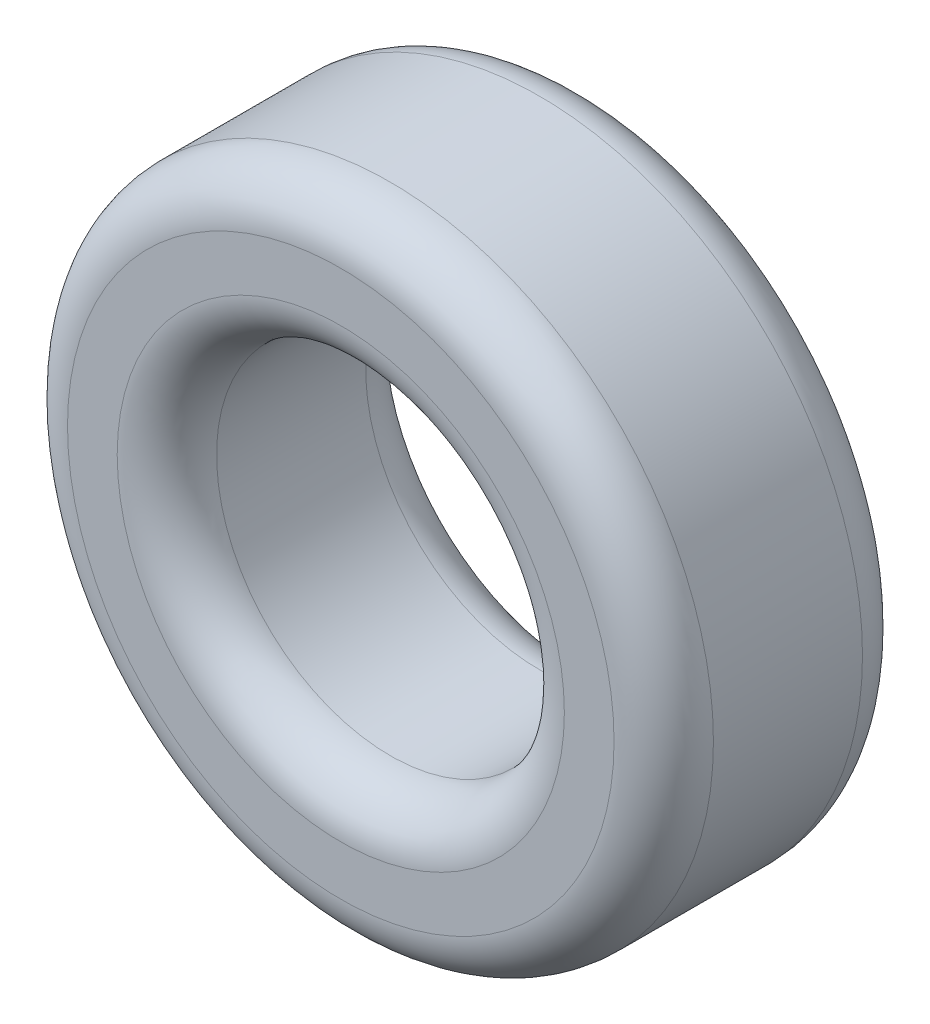
ISO-10303-21;
HEADER;
FILE_DESCRIPTION(('STEP AP214'),'2;1');
FILE_NAME('part.step','',(''),(''),'','','');
FILE_SCHEMA(('AUTOMOTIVE_DESIGN { 1 0 10303 214 1 1 1 1 }'));
ENDSEC;
DATA;
#1=APPLICATION_CONTEXT('core data for automotive mechanical design processes');
#2=APPLICATION_PROTOCOL_DEFINITION('international standard','automotive_design',2000,#1);
#3=PRODUCT_CONTEXT('',#1,'mechanical');
#4=PRODUCT('Part','Part','',(#3));
#5=PRODUCT_RELATED_PRODUCT_CATEGORY('part','',(#4));
#6=PRODUCT_DEFINITION_FORMATION('','',#4);
#7=PRODUCT_DEFINITION_CONTEXT('part definition',#1,'design');
#8=PRODUCT_DEFINITION('design','',#6,#7);
#9=PRODUCT_DEFINITION_SHAPE('','',#8);
#10=(LENGTH_UNIT() NAMED_UNIT(*) SI_UNIT(.MILLI.,.METRE.));
#11=(NAMED_UNIT(*) PLANE_ANGLE_UNIT() SI_UNIT($,.RADIAN.));
#12=(NAMED_UNIT(*) SI_UNIT($,.STERADIAN.) SOLID_ANGLE_UNIT());
#13=UNCERTAINTY_MEASURE_WITH_UNIT(LENGTH_MEASURE(1.E-05),#10,'distance_accuracy_value','');
#14=(GEOMETRIC_REPRESENTATION_CONTEXT(3) GLOBAL_UNCERTAINTY_ASSIGNED_CONTEXT((#13)) GLOBAL_UNIT_ASSIGNED_CONTEXT((#10,
#11,#12)) REPRESENTATION_CONTEXT('',''));
#15=CARTESIAN_POINT('',(0.,0.,0.));
#16=DIRECTION('',(0.,0.,1.));
#17=DIRECTION('',(1.,0.,0.));
#18=AXIS2_PLACEMENT_3D('',#15,#16,#17);
#19=CARTESIAN_POINT('',(0.,0.,-7.));
#20=DIRECTION('',(0.,0.,-1.));
#21=DIRECTION('',(-1.,0.,0.));
#22=AXIS2_PLACEMENT_3D('',#19,#20,#21);
#23=CYLINDRICAL_SURFACE('',#22,3.5);
#24=CARTESIAN_POINT('',(0.,0.,-3.));
#25=DIRECTION('',(0.,0.,1.));
#26=DIRECTION('',(1.,0.,0.));
#27=AXIS2_PLACEMENT_3D('',#24,#25,#26);
#28=CIRCLE('',#27,3.5);
#29=CARTESIAN_POINT('',(3.5,0.,-3.));
#30=VERTEX_POINT('',#29);
#31=EDGE_CURVE('E108',#30,#30,#28,.F.);
#32=ORIENTED_EDGE('',*,*,#31,.F.);
#33=EDGE_LOOP('',(#32));
#34=FACE_BOUND('',#33,.T.);
#35=CARTESIAN_POINT('',(0.,0.,-6.));
#36=DIRECTION('',(0.,0.,1.));
#37=DIRECTION('',(1.,0.,0.));
#38=AXIS2_PLACEMENT_3D('',#35,#36,#37);
#39=CIRCLE('',#38,3.5);
#40=CARTESIAN_POINT('',(3.5,0.,-6.));
#41=VERTEX_POINT('',#40);
#42=EDGE_CURVE('E104',#41,#41,#39,.T.);
#43=ORIENTED_EDGE('',*,*,#42,.F.);
#44=EDGE_LOOP('',(#43));
#45=FACE_BOUND('',#44,.T.);
#46=ADVANCED_FACE('F15',(#34,#45),#23,.F.);
#47=CARTESIAN_POINT('',(0.,0.,-3.));
#48=DIRECTION('',(0.,0.,1.));
#49=DIRECTION('',(1.,0.,0.));
#50=AXIS2_PLACEMENT_3D('',#47,#48,#49);
#51=TOROIDAL_SURFACE('',#50,4.5,1.);
#52=ORIENTED_EDGE('',*,*,#31,.T.);
#53=EDGE_LOOP('',(#52));
#54=FACE_BOUND('',#53,.T.);
#55=CARTESIAN_POINT('',(0.,0.,-2.));
#56=DIRECTION('',(0.,0.,1.));
#57=DIRECTION('',(1.,0.,0.));
#58=AXIS2_PLACEMENT_3D('',#55,#56,#57);
#59=CIRCLE('',#58,4.5);
#60=CARTESIAN_POINT('',(4.5,0.,-2.));
#61=VERTEX_POINT('',#60);
#62=EDGE_CURVE('E107',#61,#61,#59,.F.);
#63=ORIENTED_EDGE('',*,*,#62,.F.);
#64=EDGE_LOOP('',(#63));
#65=FACE_BOUND('',#64,.T.);
#66=ADVANCED_FACE('F124',(#54,#65),#51,.T.);
#67=CARTESIAN_POINT('',(0.,0.,-6.));
#68=DIRECTION('',(0.,0.,1.));
#69=DIRECTION('',(1.,0.,0.));
#70=AXIS2_PLACEMENT_3D('',#67,#68,#69);
#71=TOROIDAL_SURFACE('',#70,4.5,1.);
#72=CARTESIAN_POINT('',(0.,0.,-7.));
#73=DIRECTION('',(0.,0.,-1.));
#74=DIRECTION('',(1.,0.,0.));
#75=AXIS2_PLACEMENT_3D('',#72,#73,#74);
#76=CIRCLE('',#75,4.5);
#77=CARTESIAN_POINT('',(4.5,0.,-7.));
#78=VERTEX_POINT('',#77);
#79=EDGE_CURVE('E113',#78,#78,#76,.T.);
#80=ORIENTED_EDGE('',*,*,#79,.T.);
#81=EDGE_LOOP('',(#80));
#82=FACE_BOUND('',#81,.T.);
#83=ORIENTED_EDGE('',*,*,#42,.T.);
#84=EDGE_LOOP('',(#83));
#85=FACE_BOUND('',#84,.T.);
#86=ADVANCED_FACE('F79',(#82,#85),#71,.T.);
#87=CARTESIAN_POINT('',(0.,0.,-2.));
#88=DIRECTION('',(0.,0.,1.));
#89=DIRECTION('',(1.,0.,0.));
#90=AXIS2_PLACEMENT_3D('',#87,#88,#89);
#91=PLANE('',#90);
#92=ORIENTED_EDGE('',*,*,#62,.T.);
#93=EDGE_LOOP('',(#92));
#94=FACE_BOUND('',#93,.T.);
#95=CARTESIAN_POINT('',(0.,0.,-2.));
#96=DIRECTION('',(0.,0.,-1.));
#97=DIRECTION('',(1.,0.,0.));
#98=AXIS2_PLACEMENT_3D('',#95,#96,#97);
#99=CIRCLE('',#98,5.5);
#100=CARTESIAN_POINT('',(5.5,0.,-2.));
#101=VERTEX_POINT('',#100);
#102=EDGE_CURVE('E62',#101,#101,#99,.T.);
#103=ORIENTED_EDGE('',*,*,#102,.F.);
#104=EDGE_LOOP('',(#103));
#105=FACE_BOUND('',#104,.T.);
#106=ADVANCED_FACE('F69',(#94,#105),#91,.T.);
#107=CARTESIAN_POINT('',(0.,0.,-7.));
#108=DIRECTION('',(0.,0.,1.));
#109=DIRECTION('',(1.,0.,0.));
#110=AXIS2_PLACEMENT_3D('',#107,#108,#109);
#111=PLANE('',#110);
#112=CARTESIAN_POINT('',(0.,0.,-7.));
#113=DIRECTION('',(0.,0.,1.));
#114=DIRECTION('',(1.,0.,0.));
#115=AXIS2_PLACEMENT_3D('',#112,#113,#114);
#116=CIRCLE('',#115,5.5);
#117=CARTESIAN_POINT('',(5.5,0.,-7.));
#118=VERTEX_POINT('',#117);
#119=EDGE_CURVE('E28',#118,#118,#116,.T.);
#120=ORIENTED_EDGE('',*,*,#119,.F.);
#121=EDGE_LOOP('',(#120));
#122=FACE_BOUND('',#121,.T.);
#123=ORIENTED_EDGE('',*,*,#79,.F.);
#124=EDGE_LOOP('',(#123));
#125=FACE_BOUND('',#124,.T.);
#126=ADVANCED_FACE('F78',(#122,#125),#111,.F.);
#127=CARTESIAN_POINT('',(0.,0.,-3.));
#128=DIRECTION('',(0.,0.,1.));
#129=DIRECTION('',(1.,0.,0.));
#130=AXIS2_PLACEMENT_3D('',#127,#128,#129);
#131=TOROIDAL_SURFACE('',#130,5.5,1.);
#132=ORIENTED_EDGE('',*,*,#102,.T.);
#133=EDGE_LOOP('',(#132));
#134=FACE_BOUND('',#133,.T.);
#135=CARTESIAN_POINT('',(0.,0.,-3.));
#136=DIRECTION('',(0.,0.,-1.));
#137=DIRECTION('',(-1.,0.,0.));
#138=AXIS2_PLACEMENT_3D('',#135,#136,#137);
#139=CIRCLE('',#138,6.5);
#140=CARTESIAN_POINT('',(-6.5,0.,-3.));
#141=VERTEX_POINT('',#140);
#142=EDGE_CURVE('E23',#141,#141,#139,.T.);
#143=ORIENTED_EDGE('',*,*,#142,.F.);
#144=EDGE_LOOP('',(#143));
#145=FACE_BOUND('',#144,.T.);
#146=ADVANCED_FACE('F42',(#134,#145),#131,.T.);
#147=CARTESIAN_POINT('',(0.,0.,-6.));
#148=DIRECTION('',(0.,0.,1.));
#149=DIRECTION('',(1.,0.,0.));
#150=AXIS2_PLACEMENT_3D('',#147,#148,#149);
#151=TOROIDAL_SURFACE('',#150,5.5,1.);
#152=CARTESIAN_POINT('',(0.,0.,-6.));
#153=DIRECTION('',(0.,0.,-1.));
#154=DIRECTION('',(-1.,0.,0.));
#155=AXIS2_PLACEMENT_3D('',#152,#153,#154);
#156=CIRCLE('',#155,6.5);
#157=CARTESIAN_POINT('',(-6.5,0.,-6.));
#158=VERTEX_POINT('',#157);
#159=EDGE_CURVE('E10',#158,#158,#156,.F.);
#160=ORIENTED_EDGE('',*,*,#159,.F.);
#161=EDGE_LOOP('',(#160));
#162=FACE_BOUND('',#161,.T.);
#163=ORIENTED_EDGE('',*,*,#119,.T.);
#164=EDGE_LOOP('',(#163));
#165=FACE_BOUND('',#164,.T.);
#166=ADVANCED_FACE('F36',(#162,#165),#151,.T.);
#167=CARTESIAN_POINT('',(0.,0.,-7.));
#168=DIRECTION('',(0.,0.,-1.));
#169=DIRECTION('',(-1.,0.,0.));
#170=AXIS2_PLACEMENT_3D('',#167,#168,#169);
#171=CYLINDRICAL_SURFACE('',#170,6.5);
#172=ORIENTED_EDGE('',*,*,#159,.T.);
#173=EDGE_LOOP('',(#172));
#174=FACE_BOUND('',#173,.T.);
#175=ORIENTED_EDGE('',*,*,#142,.T.);
#176=EDGE_LOOP('',(#175));
#177=FACE_BOUND('',#176,.T.);
#178=ADVANCED_FACE('F41',(#174,#177),#171,.T.);
#179=CLOSED_SHELL('',(#46,#66,#86,#106,#126,#146,#166,#178));
#180=MANIFOLD_SOLID_BREP('B1',#179);
#181=ADVANCED_BREP_SHAPE_REPRESENTATION('',(#18,#180),#14);
#182=SHAPE_DEFINITION_REPRESENTATION(#9,#181);
ENDSEC;
END-ISO-10303-21;
